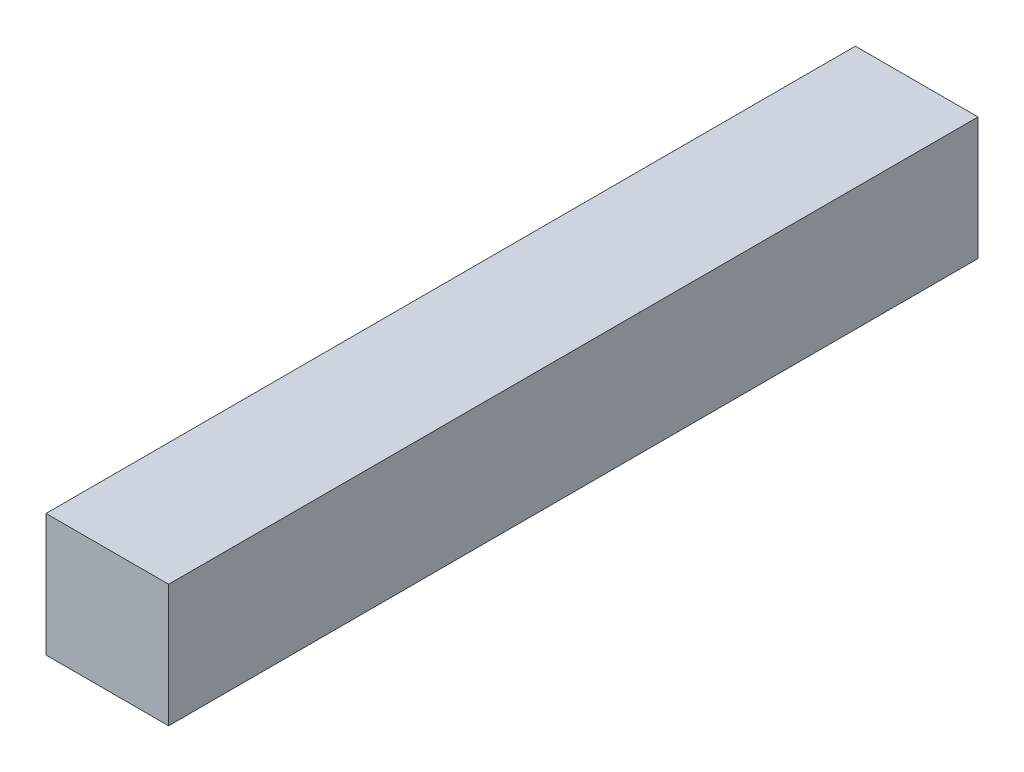
ISO-10303-21;
HEADER;
FILE_DESCRIPTION(('STEP AP214'),'2;1');
FILE_NAME('part.step','',(''),(''),'','','');
FILE_SCHEMA(('AUTOMOTIVE_DESIGN { 1 0 10303 214 1 1 1 1 }'));
ENDSEC;
DATA;
#1=APPLICATION_CONTEXT('core data for automotive mechanical design processes');
#2=APPLICATION_PROTOCOL_DEFINITION('international standard','automotive_design',2000,#1);
#3=PRODUCT_CONTEXT('',#1,'mechanical');
#4=PRODUCT('Part','Part','',(#3));
#5=PRODUCT_RELATED_PRODUCT_CATEGORY('part','',(#4));
#6=PRODUCT_DEFINITION_FORMATION('','',#4);
#7=PRODUCT_DEFINITION_CONTEXT('part definition',#1,'design');
#8=PRODUCT_DEFINITION('design','',#6,#7);
#9=PRODUCT_DEFINITION_SHAPE('','',#8);
#10=(LENGTH_UNIT() NAMED_UNIT(*) SI_UNIT(.MILLI.,.METRE.));
#11=(NAMED_UNIT(*) PLANE_ANGLE_UNIT() SI_UNIT($,.RADIAN.));
#12=(NAMED_UNIT(*) SI_UNIT($,.STERADIAN.) SOLID_ANGLE_UNIT());
#13=UNCERTAINTY_MEASURE_WITH_UNIT(LENGTH_MEASURE(1.E-05),#10,'distance_accuracy_value','');
#14=(GEOMETRIC_REPRESENTATION_CONTEXT(3) GLOBAL_UNCERTAINTY_ASSIGNED_CONTEXT((#13)) GLOBAL_UNIT_ASSIGNED_CONTEXT((#10,
#11,#12)) REPRESENTATION_CONTEXT('',''));
#15=CARTESIAN_POINT('',(0.,0.,0.));
#16=DIRECTION('',(0.,0.,1.));
#17=DIRECTION('',(1.,0.,0.));
#18=AXIS2_PLACEMENT_3D('',#15,#16,#17);
#19=CARTESIAN_POINT('',(5.,5.,66.));
#20=DIRECTION('',(-1.,0.,0.));
#21=DIRECTION('',(0.,-1.,0.));
#22=AXIS2_PLACEMENT_3D('',#19,#20,#21);
#23=PLANE('',#22);
#24=DIRECTION('',(0.,1.,0.));
#25=VECTOR('',#24,1.);
#26=CARTESIAN_POINT('',(5.,5.,0.));
#27=LINE('',#26,#25);
#28=CARTESIAN_POINT('',(5.,-5.,0.));
#29=VERTEX_POINT('',#28);
#30=CARTESIAN_POINT('',(5.,5.,0.));
#31=VERTEX_POINT('',#30);
#32=EDGE_CURVE('E94',#29,#31,#27,.T.);
#33=ORIENTED_EDGE('',*,*,#32,.T.);
#34=DIRECTION('',(0.,0.,-1.));
#35=VECTOR('',#34,1.);
#36=CARTESIAN_POINT('',(5.,5.,66.));
#37=LINE('',#36,#35);
#38=CARTESIAN_POINT('',(5.,5.,66.));
#39=VERTEX_POINT('',#38);
#40=EDGE_CURVE('E11',#39,#31,#37,.T.);
#41=ORIENTED_EDGE('',*,*,#40,.F.);
#42=DIRECTION('',(0.,1.,0.));
#43=VECTOR('',#42,1.);
#44=CARTESIAN_POINT('',(5.,5.,66.));
#45=LINE('',#44,#43);
#46=CARTESIAN_POINT('',(5.,-5.,66.));
#47=VERTEX_POINT('',#46);
#48=EDGE_CURVE('E82',#47,#39,#45,.T.);
#49=ORIENTED_EDGE('',*,*,#48,.F.);
#50=DIRECTION('',(0.,0.,-1.));
#51=VECTOR('',#50,1.);
#52=CARTESIAN_POINT('',(5.,-5.,66.));
#53=LINE('',#52,#51);
#54=EDGE_CURVE('E90',#47,#29,#53,.T.);
#55=ORIENTED_EDGE('',*,*,#54,.T.);
#56=EDGE_LOOP('',(#33,#41,#49,#55));
#57=FACE_BOUND('',#56,.T.);
#58=ADVANCED_FACE('F31',(#57),#23,.F.);
#59=CARTESIAN_POINT('',(-5.,5.,66.));
#60=DIRECTION('',(0.,-1.,0.));
#61=DIRECTION('',(0.,0.,-1.));
#62=AXIS2_PLACEMENT_3D('',#59,#60,#61);
#63=PLANE('',#62);
#64=DIRECTION('',(-1.,0.,0.));
#65=VECTOR('',#64,1.);
#66=CARTESIAN_POINT('',(-5.,5.,0.));
#67=LINE('',#66,#65);
#68=CARTESIAN_POINT('',(-5.,5.,0.));
#69=VERTEX_POINT('',#68);
#70=EDGE_CURVE('E86',#31,#69,#67,.T.);
#71=ORIENTED_EDGE('',*,*,#70,.T.);
#72=DIRECTION('',(0.,0.,-1.));
#73=VECTOR('',#72,1.);
#74=CARTESIAN_POINT('',(-5.,5.,66.));
#75=LINE('',#74,#73);
#76=CARTESIAN_POINT('',(-5.,5.,66.));
#77=VERTEX_POINT('',#76);
#78=EDGE_CURVE('E39',#77,#69,#75,.T.);
#79=ORIENTED_EDGE('',*,*,#78,.F.);
#80=DIRECTION('',(-1.,0.,0.));
#81=VECTOR('',#80,1.);
#82=CARTESIAN_POINT('',(-5.,5.,66.));
#83=LINE('',#82,#81);
#84=EDGE_CURVE('E77',#39,#77,#83,.T.);
#85=ORIENTED_EDGE('',*,*,#84,.F.);
#86=ORIENTED_EDGE('',*,*,#40,.T.);
#87=EDGE_LOOP('',(#71,#79,#85,#86));
#88=FACE_BOUND('',#87,.T.);
#89=ADVANCED_FACE('F85',(#88),#63,.F.);
#90=CARTESIAN_POINT('',(-5.,5.,66.));
#91=DIRECTION('',(1.,0.,0.));
#92=DIRECTION('',(0.,1.,0.));
#93=AXIS2_PLACEMENT_3D('',#90,#91,#92);
#94=PLANE('',#93);
#95=DIRECTION('',(0.,-1.,0.));
#96=VECTOR('',#95,1.);
#97=CARTESIAN_POINT('',(-5.,5.,0.));
#98=LINE('',#97,#96);
#99=CARTESIAN_POINT('',(-5.,-5.,0.));
#100=VERTEX_POINT('',#99);
#101=EDGE_CURVE('E64',#69,#100,#98,.T.);
#102=ORIENTED_EDGE('',*,*,#101,.T.);
#103=DIRECTION('',(0.,0.,-1.));
#104=VECTOR('',#103,1.);
#105=CARTESIAN_POINT('',(-5.,-5.,66.));
#106=LINE('',#105,#104);
#107=CARTESIAN_POINT('',(-5.,-5.,66.));
#108=VERTEX_POINT('',#107);
#109=EDGE_CURVE('E87',#108,#100,#106,.T.);
#110=ORIENTED_EDGE('',*,*,#109,.F.);
#111=DIRECTION('',(0.,-1.,0.));
#112=VECTOR('',#111,1.);
#113=CARTESIAN_POINT('',(-5.,5.,66.));
#114=LINE('',#113,#112);
#115=EDGE_CURVE('E80',#77,#108,#114,.T.);
#116=ORIENTED_EDGE('',*,*,#115,.F.);
#117=ORIENTED_EDGE('',*,*,#78,.T.);
#118=EDGE_LOOP('',(#102,#110,#116,#117));
#119=FACE_BOUND('',#118,.T.);
#120=ADVANCED_FACE('F88',(#119),#94,.F.);
#121=CARTESIAN_POINT('',(-5.,-5.,66.));
#122=DIRECTION('',(0.,1.,0.));
#123=DIRECTION('',(0.,0.,1.));
#124=AXIS2_PLACEMENT_3D('',#121,#122,#123);
#125=PLANE('',#124);
#126=DIRECTION('',(1.,0.,0.));
#127=VECTOR('',#126,1.);
#128=CARTESIAN_POINT('',(-5.,-5.,0.));
#129=LINE('',#128,#127);
#130=EDGE_CURVE('E70',#100,#29,#129,.T.);
#131=ORIENTED_EDGE('',*,*,#130,.T.);
#132=ORIENTED_EDGE('',*,*,#54,.F.);
#133=DIRECTION('',(1.,0.,0.));
#134=VECTOR('',#133,1.);
#135=CARTESIAN_POINT('',(-5.,-5.,66.));
#136=LINE('',#135,#134);
#137=EDGE_CURVE('E47',#108,#47,#136,.T.);
#138=ORIENTED_EDGE('',*,*,#137,.F.);
#139=ORIENTED_EDGE('',*,*,#109,.T.);
#140=EDGE_LOOP('',(#131,#132,#138,#139));
#141=FACE_BOUND('',#140,.T.);
#142=ADVANCED_FACE('F101',(#141),#125,.F.);
#143=CARTESIAN_POINT('',(5.,-5.,66.));
#144=DIRECTION('',(0.,0.,1.));
#145=DIRECTION('',(1.,0.,0.));
#146=AXIS2_PLACEMENT_3D('',#143,#144,#145);
#147=PLANE('',#146);
#148=ORIENTED_EDGE('',*,*,#48,.T.);
#149=ORIENTED_EDGE('',*,*,#84,.T.);
#150=ORIENTED_EDGE('',*,*,#115,.T.);
#151=ORIENTED_EDGE('',*,*,#137,.T.);
#152=EDGE_LOOP('',(#148,#149,#150,#151));
#153=FACE_BOUND('',#152,.T.);
#154=ADVANCED_FACE('F78',(#153),#147,.T.);
#155=CARTESIAN_POINT('',(5.,-5.,0.));
#156=DIRECTION('',(0.,0.,1.));
#157=DIRECTION('',(1.,0.,0.));
#158=AXIS2_PLACEMENT_3D('',#155,#156,#157);
#159=PLANE('',#158);
#160=ORIENTED_EDGE('',*,*,#32,.F.);
#161=ORIENTED_EDGE('',*,*,#130,.F.);
#162=ORIENTED_EDGE('',*,*,#101,.F.);
#163=ORIENTED_EDGE('',*,*,#70,.F.);
#164=EDGE_LOOP('',(#160,#161,#162,#163));
#165=FACE_BOUND('',#164,.T.);
#166=ADVANCED_FACE('F104',(#165),#159,.F.);
#167=CLOSED_SHELL('',(#58,#89,#120,#142,#154,#166));
#168=MANIFOLD_SOLID_BREP('B2',#167);
#169=ADVANCED_BREP_SHAPE_REPRESENTATION('',(#18,#168),#14);
#170=SHAPE_DEFINITION_REPRESENTATION(#9,#169);
ENDSEC;
END-ISO-10303-21;
